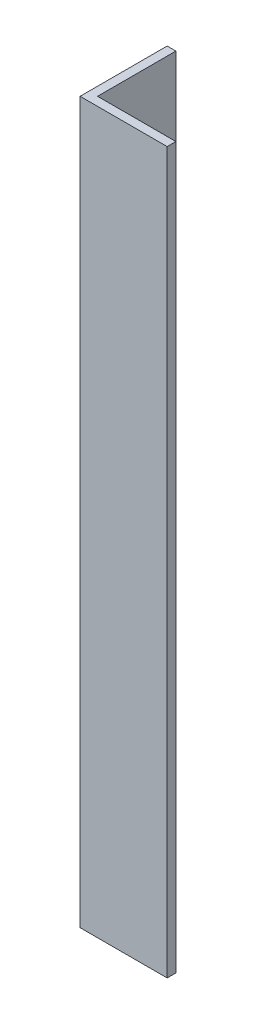
ISO-10303-21;
HEADER;
FILE_DESCRIPTION(('STEP AP214'),'2;1');
FILE_NAME('part.step','',(''),(''),'','','');
FILE_SCHEMA(('AUTOMOTIVE_DESIGN { 1 0 10303 214 1 1 1 1 }'));
ENDSEC;
DATA;
#1=APPLICATION_CONTEXT('core data for automotive mechanical design processes');
#2=APPLICATION_PROTOCOL_DEFINITION('international standard','automotive_design',2000,#1);
#3=PRODUCT_CONTEXT('',#1,'mechanical');
#4=PRODUCT('Part','Part','',(#3));
#5=PRODUCT_RELATED_PRODUCT_CATEGORY('part','',(#4));
#6=PRODUCT_DEFINITION_FORMATION('','',#4);
#7=PRODUCT_DEFINITION_CONTEXT('part definition',#1,'design');
#8=PRODUCT_DEFINITION('design','',#6,#7);
#9=PRODUCT_DEFINITION_SHAPE('','',#8);
#10=(LENGTH_UNIT() NAMED_UNIT(*) SI_UNIT(.MILLI.,.METRE.));
#11=(NAMED_UNIT(*) PLANE_ANGLE_UNIT() SI_UNIT($,.RADIAN.));
#12=(NAMED_UNIT(*) SI_UNIT($,.STERADIAN.) SOLID_ANGLE_UNIT());
#13=UNCERTAINTY_MEASURE_WITH_UNIT(LENGTH_MEASURE(1.E-05),#10,'distance_accuracy_value','');
#14=(GEOMETRIC_REPRESENTATION_CONTEXT(3) GLOBAL_UNCERTAINTY_ASSIGNED_CONTEXT((#13)) GLOBAL_UNIT_ASSIGNED_CONTEXT((#10,
#11,#12)) REPRESENTATION_CONTEXT('',''));
#15=CARTESIAN_POINT('',(0.,0.,0.));
#16=DIRECTION('',(0.,0.,1.));
#17=DIRECTION('',(1.,0.,0.));
#18=AXIS2_PLACEMENT_3D('',#15,#16,#17);
#19=CARTESIAN_POINT('',(0.,248.,12.));
#20=DIRECTION('',(0.,0.,-1.));
#21=DIRECTION('',(-1.,0.,0.));
#22=AXIS2_PLACEMENT_3D('',#19,#20,#21);
#23=PLANE('',#22);
#24=DIRECTION('',(1.,0.,0.));
#25=VECTOR('',#24,1.);
#26=CARTESIAN_POINT('',(0.,0.,12.));
#27=LINE('',#26,#25);
#28=CARTESIAN_POINT('',(-12.,0.,12.));
#29=VERTEX_POINT('',#28);
#30=CARTESIAN_POINT('',(15.,0.,12.));
#31=VERTEX_POINT('',#30);
#32=EDGE_CURVE('E117',#29,#31,#27,.T.);
#33=ORIENTED_EDGE('',*,*,#32,.F.);
#34=DIRECTION('',(0.,-1.,0.));
#35=VECTOR('',#34,1.);
#36=CARTESIAN_POINT('',(-12.,248.,12.));
#37=LINE('',#36,#35);
#38=CARTESIAN_POINT('',(-12.,248.,12.));
#39=VERTEX_POINT('',#38);
#40=EDGE_CURVE('E11',#39,#29,#37,.T.);
#41=ORIENTED_EDGE('',*,*,#40,.F.);
#42=DIRECTION('',(1.,0.,0.));
#43=VECTOR('',#42,1.);
#44=CARTESIAN_POINT('',(0.,248.,12.));
#45=LINE('',#44,#43);
#46=CARTESIAN_POINT('',(15.,248.,12.));
#47=VERTEX_POINT('',#46);
#48=EDGE_CURVE('E130',#39,#47,#45,.T.);
#49=ORIENTED_EDGE('',*,*,#48,.T.);
#50=DIRECTION('',(0.,-1.,0.));
#51=VECTOR('',#50,1.);
#52=CARTESIAN_POINT('',(15.,248.,12.));
#53=LINE('',#52,#51);
#54=EDGE_CURVE('E79',#47,#31,#53,.T.);
#55=ORIENTED_EDGE('',*,*,#54,.T.);
#56=EDGE_LOOP('',(#33,#41,#49,#55));
#57=FACE_BOUND('',#56,.T.);
#58=ADVANCED_FACE('F35',(#57),#23,.T.);
#59=CARTESIAN_POINT('',(-12.,248.,0.));
#60=DIRECTION('',(-1.,0.,0.));
#61=DIRECTION('',(0.,0.,1.));
#62=AXIS2_PLACEMENT_3D('',#59,#60,#61);
#63=PLANE('',#62);
#64=DIRECTION('',(0.,0.,-1.));
#65=VECTOR('',#64,1.);
#66=CARTESIAN_POINT('',(-12.,0.,0.));
#67=LINE('',#66,#65);
#68=CARTESIAN_POINT('',(-12.,0.,-15.));
#69=VERTEX_POINT('',#68);
#70=EDGE_CURVE('E120',#29,#69,#67,.T.);
#71=ORIENTED_EDGE('',*,*,#70,.T.);
#72=DIRECTION('',(0.,-1.,0.));
#73=VECTOR('',#72,1.);
#74=CARTESIAN_POINT('',(-12.,248.,-15.));
#75=LINE('',#74,#73);
#76=CARTESIAN_POINT('',(-12.,248.,-15.));
#77=VERTEX_POINT('',#76);
#78=EDGE_CURVE('E43',#77,#69,#75,.T.);
#79=ORIENTED_EDGE('',*,*,#78,.F.);
#80=DIRECTION('',(0.,0.,-1.));
#81=VECTOR('',#80,1.);
#82=CARTESIAN_POINT('',(-12.,248.,0.));
#83=LINE('',#82,#81);
#84=EDGE_CURVE('E112',#39,#77,#83,.T.);
#85=ORIENTED_EDGE('',*,*,#84,.F.);
#86=ORIENTED_EDGE('',*,*,#40,.T.);
#87=EDGE_LOOP('',(#71,#79,#85,#86));
#88=FACE_BOUND('',#87,.T.);
#89=ADVANCED_FACE('F139',(#88),#63,.F.);
#90=CARTESIAN_POINT('',(0.,248.,-15.));
#91=DIRECTION('',(0.,0.,-1.));
#92=DIRECTION('',(-1.,0.,0.));
#93=AXIS2_PLACEMENT_3D('',#90,#91,#92);
#94=PLANE('',#93);
#95=DIRECTION('',(1.,0.,0.));
#96=VECTOR('',#95,1.);
#97=CARTESIAN_POINT('',(0.,0.,-15.));
#98=LINE('',#97,#96);
#99=CARTESIAN_POINT('',(-15.,0.,-15.));
#100=VERTEX_POINT('',#99);
#101=EDGE_CURVE('E123',#100,#69,#98,.T.);
#102=ORIENTED_EDGE('',*,*,#101,.F.);
#103=DIRECTION('',(0.,-1.,0.));
#104=VECTOR('',#103,1.);
#105=CARTESIAN_POINT('',(-15.,248.,-15.));
#106=LINE('',#105,#104);
#107=CARTESIAN_POINT('',(-15.,248.,-15.));
#108=VERTEX_POINT('',#107);
#109=EDGE_CURVE('E101',#108,#100,#106,.T.);
#110=ORIENTED_EDGE('',*,*,#109,.F.);
#111=DIRECTION('',(1.,0.,0.));
#112=VECTOR('',#111,1.);
#113=CARTESIAN_POINT('',(0.,248.,-15.));
#114=LINE('',#113,#112);
#115=EDGE_CURVE('E110',#108,#77,#114,.T.);
#116=ORIENTED_EDGE('',*,*,#115,.T.);
#117=ORIENTED_EDGE('',*,*,#78,.T.);
#118=EDGE_LOOP('',(#102,#110,#116,#117));
#119=FACE_BOUND('',#118,.T.);
#120=ADVANCED_FACE('F136',(#119),#94,.T.);
#121=CARTESIAN_POINT('',(-15.,248.,0.));
#122=DIRECTION('',(-1.,0.,0.));
#123=DIRECTION('',(0.,0.,1.));
#124=AXIS2_PLACEMENT_3D('',#121,#122,#123);
#125=PLANE('',#124);
#126=DIRECTION('',(0.,0.,-1.));
#127=VECTOR('',#126,1.);
#128=CARTESIAN_POINT('',(-15.,0.,0.));
#129=LINE('',#128,#127);
#130=CARTESIAN_POINT('',(-15.,0.,15.));
#131=VERTEX_POINT('',#130);
#132=EDGE_CURVE('E100',#131,#100,#129,.T.);
#133=ORIENTED_EDGE('',*,*,#132,.F.);
#134=DIRECTION('',(0.,-1.,0.));
#135=VECTOR('',#134,1.);
#136=CARTESIAN_POINT('',(-15.,248.,15.));
#137=LINE('',#136,#135);
#138=CARTESIAN_POINT('',(-15.,248.,15.));
#139=VERTEX_POINT('',#138);
#140=EDGE_CURVE('E94',#139,#131,#137,.T.);
#141=ORIENTED_EDGE('',*,*,#140,.F.);
#142=DIRECTION('',(0.,0.,-1.));
#143=VECTOR('',#142,1.);
#144=CARTESIAN_POINT('',(-15.,248.,0.));
#145=LINE('',#144,#143);
#146=EDGE_CURVE('E98',#139,#108,#145,.T.);
#147=ORIENTED_EDGE('',*,*,#146,.T.);
#148=ORIENTED_EDGE('',*,*,#109,.T.);
#149=EDGE_LOOP('',(#133,#141,#147,#148));
#150=FACE_BOUND('',#149,.T.);
#151=ADVANCED_FACE('F96',(#150),#125,.T.);
#152=CARTESIAN_POINT('',(0.,248.,15.));
#153=DIRECTION('',(0.,0.,-1.));
#154=DIRECTION('',(-1.,0.,0.));
#155=AXIS2_PLACEMENT_3D('',#152,#153,#154);
#156=PLANE('',#155);
#157=DIRECTION('',(1.,0.,0.));
#158=VECTOR('',#157,1.);
#159=CARTESIAN_POINT('',(0.,0.,15.));
#160=LINE('',#159,#158);
#161=CARTESIAN_POINT('',(15.,0.,15.));
#162=VERTEX_POINT('',#161);
#163=EDGE_CURVE('E72',#131,#162,#160,.T.);
#164=ORIENTED_EDGE('',*,*,#163,.T.);
#165=DIRECTION('',(0.,-1.,0.));
#166=VECTOR('',#165,1.);
#167=CARTESIAN_POINT('',(15.,248.,15.));
#168=LINE('',#167,#166);
#169=CARTESIAN_POINT('',(15.,248.,15.));
#170=VERTEX_POINT('',#169);
#171=EDGE_CURVE('E102',#170,#162,#168,.T.);
#172=ORIENTED_EDGE('',*,*,#171,.F.);
#173=DIRECTION('',(1.,0.,0.));
#174=VECTOR('',#173,1.);
#175=CARTESIAN_POINT('',(0.,248.,15.));
#176=LINE('',#175,#174);
#177=EDGE_CURVE('E104',#139,#170,#176,.T.);
#178=ORIENTED_EDGE('',*,*,#177,.F.);
#179=ORIENTED_EDGE('',*,*,#140,.T.);
#180=EDGE_LOOP('',(#164,#172,#178,#179));
#181=FACE_BOUND('',#180,.T.);
#182=ADVANCED_FACE('F105',(#181),#156,.F.);
#183=CARTESIAN_POINT('',(15.,248.,0.));
#184=DIRECTION('',(-1.,0.,0.));
#185=DIRECTION('',(0.,0.,1.));
#186=AXIS2_PLACEMENT_3D('',#183,#184,#185);
#187=PLANE('',#186);
#188=DIRECTION('',(0.,0.,-1.));
#189=VECTOR('',#188,1.);
#190=CARTESIAN_POINT('',(15.,0.,0.));
#191=LINE('',#190,#189);
#192=EDGE_CURVE('E128',#162,#31,#191,.T.);
#193=ORIENTED_EDGE('',*,*,#192,.T.);
#194=ORIENTED_EDGE('',*,*,#54,.F.);
#195=DIRECTION('',(0.,0.,-1.));
#196=VECTOR('',#195,1.);
#197=CARTESIAN_POINT('',(15.,248.,0.));
#198=LINE('',#197,#196);
#199=EDGE_CURVE('E51',#170,#47,#198,.T.);
#200=ORIENTED_EDGE('',*,*,#199,.F.);
#201=ORIENTED_EDGE('',*,*,#171,.T.);
#202=EDGE_LOOP('',(#193,#194,#200,#201));
#203=FACE_BOUND('',#202,.T.);
#204=ADVANCED_FACE('F144',(#203),#187,.F.);
#205=CARTESIAN_POINT('',(0.,248.,0.));
#206=DIRECTION('',(0.,1.,0.));
#207=DIRECTION('',(0.,0.,1.));
#208=AXIS2_PLACEMENT_3D('',#205,#206,#207);
#209=PLANE('',#208);
#210=ORIENTED_EDGE('',*,*,#48,.F.);
#211=ORIENTED_EDGE('',*,*,#84,.T.);
#212=ORIENTED_EDGE('',*,*,#115,.F.);
#213=ORIENTED_EDGE('',*,*,#146,.F.);
#214=ORIENTED_EDGE('',*,*,#177,.T.);
#215=ORIENTED_EDGE('',*,*,#199,.T.);
#216=EDGE_LOOP('',(#210,#211,#212,#213,#214,#215));
#217=FACE_BOUND('',#216,.T.);
#218=ADVANCED_FACE('F108',(#217),#209,.T.);
#219=CARTESIAN_POINT('',(0.,0.,0.));
#220=DIRECTION('',(0.,1.,0.));
#221=DIRECTION('',(0.,0.,1.));
#222=AXIS2_PLACEMENT_3D('',#219,#220,#221);
#223=PLANE('',#222);
#224=ORIENTED_EDGE('',*,*,#32,.T.);
#225=ORIENTED_EDGE('',*,*,#192,.F.);
#226=ORIENTED_EDGE('',*,*,#163,.F.);
#227=ORIENTED_EDGE('',*,*,#132,.T.);
#228=ORIENTED_EDGE('',*,*,#101,.T.);
#229=ORIENTED_EDGE('',*,*,#70,.F.);
#230=EDGE_LOOP('',(#224,#225,#226,#227,#228,#229));
#231=FACE_BOUND('',#230,.T.);
#232=ADVANCED_FACE('F141',(#231),#223,.F.);
#233=CLOSED_SHELL('',(#58,#89,#120,#151,#182,#204,#218,#232));
#234=MANIFOLD_SOLID_BREP('B2',#233);
#235=ADVANCED_BREP_SHAPE_REPRESENTATION('',(#18,#234),#14);
#236=SHAPE_DEFINITION_REPRESENTATION(#9,#235);
ENDSEC;
END-ISO-10303-21;
